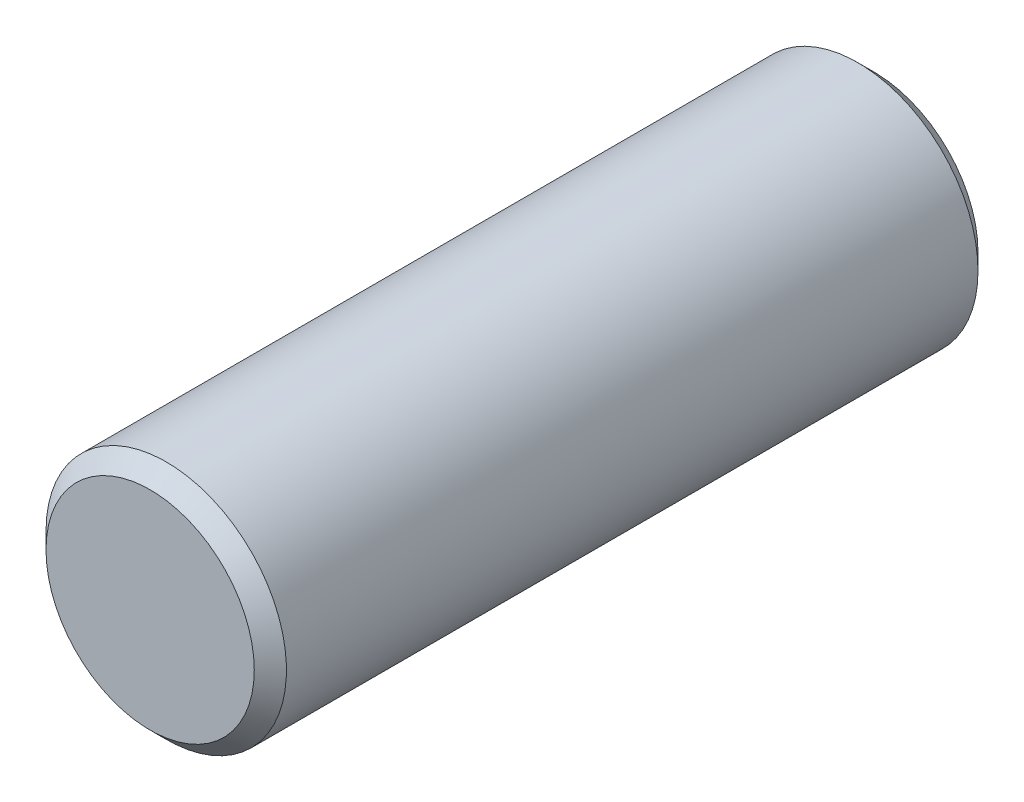
ISO-10303-21;
HEADER;
FILE_DESCRIPTION(('STEP AP214'),'2;1');
FILE_NAME('part.step','',(''),(''),'','','');
FILE_SCHEMA(('AUTOMOTIVE_DESIGN { 1 0 10303 214 1 1 1 1 }'));
ENDSEC;
DATA;
#1=APPLICATION_CONTEXT('core data for automotive mechanical design processes');
#2=APPLICATION_PROTOCOL_DEFINITION('international standard','automotive_design',2000,#1);
#3=PRODUCT_CONTEXT('',#1,'mechanical');
#4=PRODUCT('Part','Part','',(#3));
#5=PRODUCT_RELATED_PRODUCT_CATEGORY('part','',(#4));
#6=PRODUCT_DEFINITION_FORMATION('','',#4);
#7=PRODUCT_DEFINITION_CONTEXT('part definition',#1,'design');
#8=PRODUCT_DEFINITION('design','',#6,#7);
#9=PRODUCT_DEFINITION_SHAPE('','',#8);
#10=(LENGTH_UNIT() NAMED_UNIT(*) SI_UNIT(.MILLI.,.METRE.));
#11=(NAMED_UNIT(*) PLANE_ANGLE_UNIT() SI_UNIT($,.RADIAN.));
#12=(NAMED_UNIT(*) SI_UNIT($,.STERADIAN.) SOLID_ANGLE_UNIT());
#13=UNCERTAINTY_MEASURE_WITH_UNIT(LENGTH_MEASURE(1.E-05),#10,'distance_accuracy_value','');
#14=(GEOMETRIC_REPRESENTATION_CONTEXT(3) GLOBAL_UNCERTAINTY_ASSIGNED_CONTEXT((#13)) GLOBAL_UNIT_ASSIGNED_CONTEXT((#10,
#11,#12)) REPRESENTATION_CONTEXT('',''));
#15=CARTESIAN_POINT('',(0.,0.,0.));
#16=DIRECTION('',(0.,0.,1.));
#17=DIRECTION('',(1.,0.,0.));
#18=AXIS2_PLACEMENT_3D('',#15,#16,#17);
#19=CARTESIAN_POINT('',(0.,0.,45.));
#20=DIRECTION('',(0.,0.,-1.));
#21=DIRECTION('',(-1.,0.,0.));
#22=AXIS2_PLACEMENT_3D('',#19,#20,#21);
#23=CYLINDRICAL_SURFACE('',#22,7.475);
#24=CARTESIAN_POINT('',(0.,0.,44.));
#25=DIRECTION('',(0.,0.,1.));
#26=DIRECTION('',(1.,0.,0.));
#27=AXIS2_PLACEMENT_3D('',#24,#25,#26);
#28=CIRCLE('',#27,7.475);
#29=CARTESIAN_POINT('',(-7.475,0.,44.));
#30=VERTEX_POINT('',#29);
#31=EDGE_CURVE('E38',#30,#30,#28,.F.);
#32=CARTESIAN_POINT('',(0.,0.,1.00000000000003));
#33=DIRECTION('',(0.,0.,1.));
#34=DIRECTION('',(1.,0.,0.));
#35=AXIS2_PLACEMENT_3D('',#32,#33,#34);
#36=CIRCLE('',#35,7.475);
#37=CARTESIAN_POINT('',(-7.475,0.,1.00000000000002));
#38=VERTEX_POINT('',#37);
#39=EDGE_CURVE('E42',#38,#38,#36,.T.);
#40=CARTESIAN_POINT('',(-7.475,0.,44.));
#41=CARTESIAN_POINT('',(-7.475,0.,43.5520833333333));
#42=CARTESIAN_POINT('',(-7.475,0.,43.1041666666667));
#43=CARTESIAN_POINT('',(-7.475,0.,42.2083333333334));
#44=CARTESIAN_POINT('',(-7.475,0.,41.7604166666667));
#45=CARTESIAN_POINT('',(-7.475,0.,40.8645833333334));
#46=CARTESIAN_POINT('',(-7.475,0.,40.4166666666667));
#47=CARTESIAN_POINT('',(-7.475,0.,39.5208333333334));
#48=CARTESIAN_POINT('',(-7.475,0.,39.0729166666667));
#49=CARTESIAN_POINT('',(-7.475,0.,38.1770833333334));
#50=CARTESIAN_POINT('',(-7.475,0.,37.7291666666667));
#51=CARTESIAN_POINT('',(-7.475,0.,36.8333333333334));
#52=CARTESIAN_POINT('',(-7.475,0.,36.3854166666667));
#53=CARTESIAN_POINT('',(-7.475,0.,35.4895833333334));
#54=CARTESIAN_POINT('',(-7.475,0.,35.0416666666667));
#55=CARTESIAN_POINT('',(-7.475,0.,34.1458333333334));
#56=CARTESIAN_POINT('',(-7.475,0.,33.6979166666667));
#57=CARTESIAN_POINT('',(-7.475,0.,32.8020833333334));
#58=CARTESIAN_POINT('',(-7.475,0.,32.3541666666667));
#59=CARTESIAN_POINT('',(-7.475,0.,31.4583333333334));
#60=CARTESIAN_POINT('',(-7.475,0.,31.0104166666667));
#61=CARTESIAN_POINT('',(-7.475,0.,30.1145833333334));
#62=CARTESIAN_POINT('',(-7.475,0.,29.6666666666667));
#63=CARTESIAN_POINT('',(-7.475,0.,28.7708333333334));
#64=CARTESIAN_POINT('',(-7.475,0.,28.3229166666667));
#65=CARTESIAN_POINT('',(-7.475,0.,27.4270833333334));
#66=CARTESIAN_POINT('',(-7.475,0.,26.9791666666667));
#67=CARTESIAN_POINT('',(-7.475,0.,26.0833333333334));
#68=CARTESIAN_POINT('',(-7.475,0.,25.6354166666667));
#69=CARTESIAN_POINT('',(-7.475,0.,24.7395833333334));
#70=CARTESIAN_POINT('',(-7.475,0.,24.2916666666667));
#71=CARTESIAN_POINT('',(-7.475,0.,23.3958333333334));
#72=CARTESIAN_POINT('',(-7.475,0.,22.9479166666667));
#73=CARTESIAN_POINT('',(-7.475,0.,22.0520833333334));
#74=CARTESIAN_POINT('',(-7.475,0.,21.6041666666667));
#75=CARTESIAN_POINT('',(-7.475,0.,20.7083333333334));
#76=CARTESIAN_POINT('',(-7.475,0.,20.2604166666667));
#77=CARTESIAN_POINT('',(-7.475,0.,19.3645833333334));
#78=CARTESIAN_POINT('',(-7.475,0.,18.9166666666667));
#79=CARTESIAN_POINT('',(-7.475,0.,18.0208333333334));
#80=CARTESIAN_POINT('',(-7.475,0.,17.5729166666667));
#81=CARTESIAN_POINT('',(-7.475,0.,16.6770833333334));
#82=CARTESIAN_POINT('',(-7.475,0.,16.2291666666667));
#83=CARTESIAN_POINT('',(-7.475,0.,15.3333333333334));
#84=CARTESIAN_POINT('',(-7.475,0.,14.8854166666667));
#85=CARTESIAN_POINT('',(-7.475,0.,13.9895833333334));
#86=CARTESIAN_POINT('',(-7.475,0.,13.5416666666667));
#87=CARTESIAN_POINT('',(-7.475,0.,12.6458333333334));
#88=CARTESIAN_POINT('',(-7.475,0.,12.1979166666667));
#89=CARTESIAN_POINT('',(-7.475,0.,11.3020833333334));
#90=CARTESIAN_POINT('',(-7.475,0.,10.8541666666667));
#91=CARTESIAN_POINT('',(-7.475,0.,9.95833333333335));
#92=CARTESIAN_POINT('',(-7.475,0.,9.51041666666669));
#93=CARTESIAN_POINT('',(-7.475,0.,8.61458333333336));
#94=CARTESIAN_POINT('',(-7.475,0.,8.16666666666669));
#95=CARTESIAN_POINT('',(-7.475,0.,7.27083333333336));
#96=CARTESIAN_POINT('',(-7.475,0.,6.82291666666669));
#97=CARTESIAN_POINT('',(-7.475,0.,5.92708333333335));
#98=CARTESIAN_POINT('',(-7.475,0.,5.47916666666669));
#99=CARTESIAN_POINT('',(-7.475,0.,4.58333333333336));
#100=CARTESIAN_POINT('',(-7.475,0.,4.13541666666669));
#101=CARTESIAN_POINT('',(-7.475,0.,3.23958333333336));
#102=CARTESIAN_POINT('',(-7.475,0.,2.79166666666669));
#103=CARTESIAN_POINT('',(-7.475,0.,1.89583333333335));
#104=CARTESIAN_POINT('',(-7.475,0.,1.44791666666669));
#105=CARTESIAN_POINT('',(-7.475,0.,1.00000000000002));
#106=B_SPLINE_CURVE_WITH_KNOTS('',3,(#40,#41,#42,#43,#44,#45,#46,#47,#48,#49,#50,#51,#52,#53,
#54,#55,#56,#57,#58,#59,#60,#61,#62,#63,#64,#65,#66,#67,#68,#69,#70,#71,#72,#73,#74,#75,#76,#77,
#78,#79,#80,#81,#82,#83,#84,#85,#86,#87,#88,#89,#90,#91,#92,#93,#94,#95,#96,#97,#98,#99,#100,
#101,#102,#103,#104,#105),.UNSPECIFIED.,.F.,.F.,(4,2,2,2,2,2,2,2,2,2,2,2,2,2,2,2,2,2,2,2,2,2,2,
2,2,2,2,2,2,2,2,2,4),(0.,1.34375,2.6875,4.03124999999999,5.375,6.71875,8.06249999999999,9.40625,
10.75,12.09375,13.4375,14.78125,16.125,17.46875,18.8125,20.15625,21.5,22.84375,24.1875,25.53125,
26.875,28.21875,29.5625,30.90625,32.25,33.59375,34.9375,36.28125,37.625,38.96875,40.3125,
41.65625,43.),.UNSPECIFIED.);
#107=EDGE_CURVE('BSEAM31',#30,#38,#106,.T.);
#108=ORIENTED_EDGE('',*,*,#31,.T.);
#109=ORIENTED_EDGE('',*,*,#39,.T.);
#110=ORIENTED_EDGE('',*,*,#107,.T.);
#111=ORIENTED_EDGE('',*,*,#107,.F.);
#112=EDGE_LOOP('',(#108,#110,#109,#111));
#113=FACE_BOUND('',#112,.T.);
#114=ADVANCED_FACE('F31',(#113),#23,.T.);
#115=CARTESIAN_POINT('',(0.,0.,45.));
#116=DIRECTION('',(0.,0.,1.));
#117=DIRECTION('',(1.,0.,0.));
#118=AXIS2_PLACEMENT_3D('',#115,#116,#117);
#119=PLANE('',#118);
#120=CARTESIAN_POINT('',(0.,0.,45.));
#121=DIRECTION('',(0.,0.,1.));
#122=DIRECTION('',(1.,0.,0.));
#123=AXIS2_PLACEMENT_3D('',#120,#121,#122);
#124=CIRCLE('',#123,6.47500000000003);
#125=CARTESIAN_POINT('',(6.47500000000003,0.,45.));
#126=VERTEX_POINT('',#125);
#127=EDGE_CURVE('E46',#126,#126,#124,.T.);
#128=ORIENTED_EDGE('',*,*,#127,.T.);
#129=EDGE_LOOP('',(#128));
#130=FACE_BOUND('',#129,.T.);
#131=ADVANCED_FACE('F52',(#130),#119,.T.);
#132=CARTESIAN_POINT('',(0.,0.,0.));
#133=DIRECTION('',(0.,0.,1.));
#134=DIRECTION('',(1.,0.,0.));
#135=AXIS2_PLACEMENT_3D('',#132,#133,#134);
#136=PLANE('',#135);
#137=CARTESIAN_POINT('',(0.,0.,0.));
#138=DIRECTION('',(0.,0.,1.));
#139=DIRECTION('',(1.,0.,0.));
#140=AXIS2_PLACEMENT_3D('',#137,#138,#139);
#141=CIRCLE('',#140,6.47499999999997);
#142=CARTESIAN_POINT('',(6.47499999999997,0.,0.));
#143=VERTEX_POINT('',#142);
#144=EDGE_CURVE('E10',#143,#143,#141,.F.);
#145=ORIENTED_EDGE('',*,*,#144,.T.);
#146=EDGE_LOOP('',(#145));
#147=FACE_BOUND('',#146,.T.);
#148=ADVANCED_FACE('F56',(#147),#136,.F.);
#149=CARTESIAN_POINT('',(0.,0.,45.));
#150=DIRECTION('',(0.,0.,-1.));
#151=DIRECTION('',(-1.,0.,0.));
#152=AXIS2_PLACEMENT_3D('',#149,#150,#151);
#153=CONICAL_SURFACE('',#152,6.47500000000003,0.785398163397447);
#154=ORIENTED_EDGE('',*,*,#31,.F.);
#155=EDGE_LOOP('',(#154));
#156=FACE_BOUND('',#155,.T.);
#157=ORIENTED_EDGE('',*,*,#127,.F.);
#158=EDGE_LOOP('',(#157));
#159=FACE_BOUND('',#158,.T.);
#160=ADVANCED_FACE('F54',(#156,#159),#153,.T.);
#161=CARTESIAN_POINT('',(0.,0.,1.00000000000003));
#162=DIRECTION('',(0.,0.,1.));
#163=DIRECTION('',(1.,0.,0.));
#164=AXIS2_PLACEMENT_3D('',#161,#162,#163);
#165=CONICAL_SURFACE('',#164,7.475,0.785398163397449);
#166=ORIENTED_EDGE('',*,*,#144,.F.);
#167=EDGE_LOOP('',(#166));
#168=FACE_BOUND('',#167,.T.);
#169=ORIENTED_EDGE('',*,*,#39,.F.);
#170=EDGE_LOOP('',(#169));
#171=FACE_BOUND('',#170,.T.);
#172=ADVANCED_FACE('F33',(#168,#171),#165,.T.);
#173=CLOSED_SHELL('',(#114,#131,#148,#160,#172));
#174=MANIFOLD_SOLID_BREP('B2',#173);
#175=ADVANCED_BREP_SHAPE_REPRESENTATION('',(#18,#174),#14);
#176=SHAPE_DEFINITION_REPRESENTATION(#9,#175);
ENDSEC;
END-ISO-10303-21;
